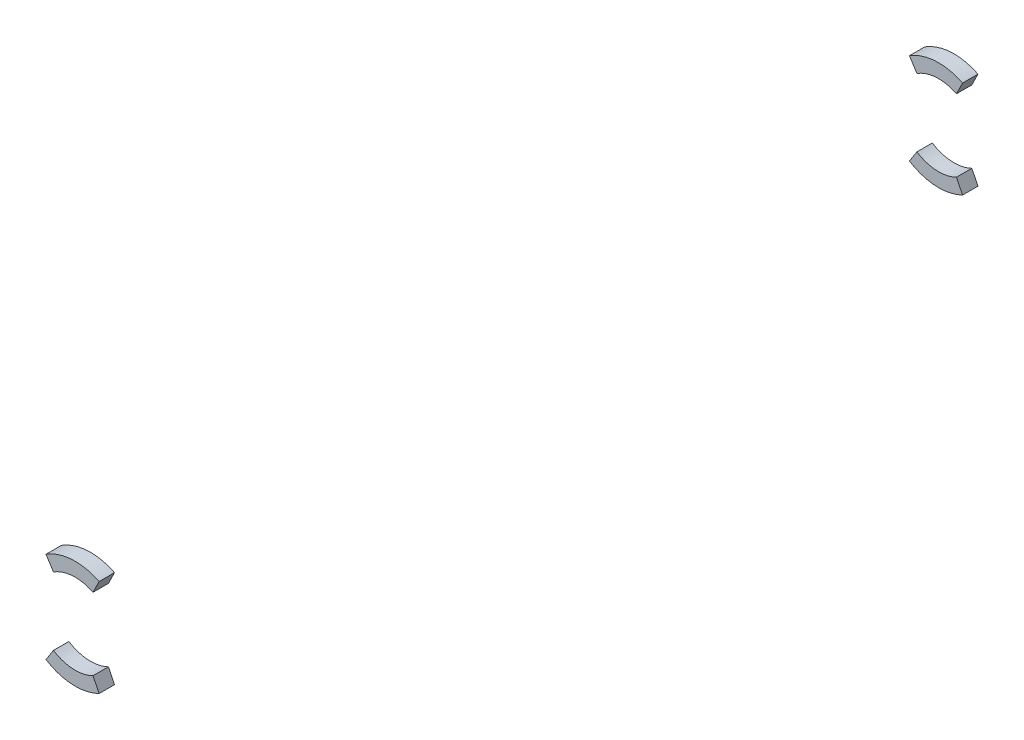
ISO-10303-21;
HEADER;
FILE_DESCRIPTION(('STEP AP214'),'2;1');
FILE_NAME('part.step','',(''),(''),'','','');
FILE_SCHEMA(('AUTOMOTIVE_DESIGN { 1 0 10303 214 1 1 1 1 }'));
ENDSEC;
DATA;
#1=APPLICATION_CONTEXT('core data for automotive mechanical design processes');
#2=APPLICATION_PROTOCOL_DEFINITION('international standard','automotive_design',2000,#1);
#3=PRODUCT_CONTEXT('',#1,'mechanical');
#4=PRODUCT('Part','Part','',(#3));
#5=PRODUCT_RELATED_PRODUCT_CATEGORY('part','',(#4));
#6=PRODUCT_DEFINITION_FORMATION('','',#4);
#7=PRODUCT_DEFINITION_CONTEXT('part definition',#1,'design');
#8=PRODUCT_DEFINITION('design','',#6,#7);
#9=PRODUCT_DEFINITION_SHAPE('','',#8);
#10=(LENGTH_UNIT() NAMED_UNIT(*) SI_UNIT(.MILLI.,.METRE.));
#11=(NAMED_UNIT(*) PLANE_ANGLE_UNIT() SI_UNIT($,.RADIAN.));
#12=(NAMED_UNIT(*) SI_UNIT($,.STERADIAN.) SOLID_ANGLE_UNIT());
#13=UNCERTAINTY_MEASURE_WITH_UNIT(LENGTH_MEASURE(1.E-05),#10,'distance_accuracy_value','');
#14=(GEOMETRIC_REPRESENTATION_CONTEXT(3) GLOBAL_UNCERTAINTY_ASSIGNED_CONTEXT((#13)) GLOBAL_UNIT_ASSIGNED_CONTEXT((#10,
#11,#12)) REPRESENTATION_CONTEXT('',''));
#15=CARTESIAN_POINT('',(0.,0.,0.));
#16=DIRECTION('',(0.,0.,1.));
#17=DIRECTION('',(1.,0.,0.));
#18=AXIS2_PLACEMENT_3D('',#15,#16,#17);
#19=CARTESIAN_POINT('',(0.,0.,1100.));
#20=DIRECTION('',(0.,0.,1.));
#21=DIRECTION('',(1.,0.,0.));
#22=AXIS2_PLACEMENT_3D('',#19,#20,#21);
#23=CYLINDRICAL_SURFACE('',#22,70.1988909444927);
#24=CARTESIAN_POINT('',(0.,0.,1120.));
#25=DIRECTION('',(0.,0.,1.));
#26=DIRECTION('',(1.,0.,0.));
#27=AXIS2_PLACEMENT_3D('',#24,#25,#26);
#28=CIRCLE('',#27,70.1988909444927);
#29=CARTESIAN_POINT('',(-37.8214558862849,-59.1390037494595,1120.));
#30=VERTEX_POINT('',#29);
#31=CARTESIAN_POINT('',(31.1075264082809,-62.9301683661731,1120.));
#32=VERTEX_POINT('',#31);
#33=EDGE_CURVE('E114',#30,#32,#28,.T.);
#34=ORIENTED_EDGE('',*,*,#33,.F.);
#35=DIRECTION('',(0.,0.,1.));
#36=VECTOR('',#35,1.);
#37=CARTESIAN_POINT('',(-37.8214558862849,-59.1390037494595,1100.));
#38=LINE('',#37,#36);
#39=CARTESIAN_POINT('',(-37.8214558862849,-59.1390037494595,1100.));
#40=VERTEX_POINT('',#39);
#41=EDGE_CURVE('E12',#40,#30,#38,.T.);
#42=ORIENTED_EDGE('',*,*,#41,.F.);
#43=CARTESIAN_POINT('',(0.,0.,1100.));
#44=DIRECTION('',(0.,0.,1.));
#45=DIRECTION('',(1.,0.,0.));
#46=AXIS2_PLACEMENT_3D('',#43,#44,#45);
#47=CIRCLE('',#46,70.1988909444927);
#48=CARTESIAN_POINT('',(31.1075264082809,-62.9301683661731,1100.));
#49=VERTEX_POINT('',#48);
#50=EDGE_CURVE('E108',#40,#49,#47,.T.);
#51=ORIENTED_EDGE('',*,*,#50,.T.);
#52=DIRECTION('',(0.,0.,1.));
#53=VECTOR('',#52,1.);
#54=CARTESIAN_POINT('',(31.1075264082809,-62.9301683661731,1100.));
#55=LINE('',#54,#53);
#56=EDGE_CURVE('E53',#49,#32,#55,.T.);
#57=ORIENTED_EDGE('',*,*,#56,.T.);
#58=EDGE_LOOP('',(#34,#42,#51,#57));
#59=FACE_BOUND('',#58,.T.);
#60=ADVANCED_FACE('F50',(#59),#23,.T.);
#61=CARTESIAN_POINT('',(-37.8214558862849,-59.1390037494595,1100.));
#62=DIRECTION('',(-0.842449260291328,0.538775689721237,0.));
#63=DIRECTION('',(-0.538775689721237,-0.842449260291328,0.));
#64=AXIS2_PLACEMENT_3D('',#61,#62,#63);
#65=PLANE('',#64);
#66=DIRECTION('',(-0.538775689721237,-0.842449260291328,0.));
#67=VECTOR('',#66,1.);
#68=CARTESIAN_POINT('',(-37.8214558862849,-59.1390037494595,1120.));
#69=LINE('',#68,#67);
#70=CARTESIAN_POINT('',(-28.1601263047385,-44.0321974946789,1120.));
#71=VERTEX_POINT('',#70);
#72=EDGE_CURVE('E110',#71,#30,#69,.T.);
#73=ORIENTED_EDGE('',*,*,#72,.F.);
#74=DIRECTION('',(0.,0.,1.));
#75=VECTOR('',#74,1.);
#76=CARTESIAN_POINT('',(-28.1601263047385,-44.0321974946789,1100.));
#77=LINE('',#76,#75);
#78=CARTESIAN_POINT('',(-28.1601263047385,-44.0321974946789,1100.));
#79=VERTEX_POINT('',#78);
#80=EDGE_CURVE('E59',#79,#71,#77,.T.);
#81=ORIENTED_EDGE('',*,*,#80,.F.);
#82=DIRECTION('',(-0.538775689721237,-0.842449260291328,0.));
#83=VECTOR('',#82,1.);
#84=CARTESIAN_POINT('',(-37.8214558862849,-59.1390037494595,1100.));
#85=LINE('',#84,#83);
#86=EDGE_CURVE('E105',#79,#40,#85,.T.);
#87=ORIENTED_EDGE('',*,*,#86,.T.);
#88=ORIENTED_EDGE('',*,*,#41,.T.);
#89=EDGE_LOOP('',(#73,#81,#87,#88));
#90=FACE_BOUND('',#89,.T.);
#91=ADVANCED_FACE('F124',(#90),#65,.T.);
#92=CARTESIAN_POINT('',(0.,0.,1100.));
#93=DIRECTION('',(0.,0.,1.));
#94=DIRECTION('',(1.,0.,0.));
#95=AXIS2_PLACEMENT_3D('',#92,#93,#94);
#96=CYLINDRICAL_SURFACE('',#95,52.2668836808665);
#97=CARTESIAN_POINT('',(0.,0.,1120.));
#98=DIRECTION('',(0.,0.,-1.));
#99=DIRECTION('',(1.,0.,0.));
#100=AXIS2_PLACEMENT_3D('',#97,#98,#99);
#101=CIRCLE('',#100,52.2668836808665);
#102=CARTESIAN_POINT('',(23.1612414741241,-46.8549252809834,1120.));
#103=VERTEX_POINT('',#102);
#104=EDGE_CURVE('E100',#103,#71,#101,.T.);
#105=ORIENTED_EDGE('',*,*,#104,.F.);
#106=DIRECTION('',(0.,0.,1.));
#107=VECTOR('',#106,1.);
#108=CARTESIAN_POINT('',(23.1612414741241,-46.8549252809834,1100.));
#109=LINE('',#108,#107);
#110=CARTESIAN_POINT('',(23.1612414741241,-46.8549252809834,1100.));
#111=VERTEX_POINT('',#110);
#112=EDGE_CURVE('E95',#111,#103,#109,.T.);
#113=ORIENTED_EDGE('',*,*,#112,.F.);
#114=CARTESIAN_POINT('',(0.,0.,1100.));
#115=DIRECTION('',(0.,0.,-1.));
#116=DIRECTION('',(1.,0.,0.));
#117=AXIS2_PLACEMENT_3D('',#114,#115,#116);
#118=CIRCLE('',#117,52.2668836808665);
#119=EDGE_CURVE('E98',#111,#79,#118,.T.);
#120=ORIENTED_EDGE('',*,*,#119,.T.);
#121=ORIENTED_EDGE('',*,*,#80,.T.);
#122=EDGE_LOOP('',(#105,#113,#120,#121));
#123=FACE_BOUND('',#122,.T.);
#124=ADVANCED_FACE('F97',(#123),#96,.F.);
#125=CARTESIAN_POINT('',(31.1075264082809,-62.9301683661731,1100.));
#126=DIRECTION('',(0.896455307476764,0.443134157673204,0.));
#127=DIRECTION('',(-0.443134157673204,0.896455307476764,0.));
#128=AXIS2_PLACEMENT_3D('',#125,#126,#127);
#129=PLANE('',#128);
#130=DIRECTION('',(-0.443134157673204,0.896455307476764,0.));
#131=VECTOR('',#130,1.);
#132=CARTESIAN_POINT('',(31.1075264082809,-62.9301683661731,1120.));
#133=LINE('',#132,#131);
#134=EDGE_CURVE('E117',#32,#103,#133,.T.);
#135=ORIENTED_EDGE('',*,*,#134,.F.);
#136=ORIENTED_EDGE('',*,*,#56,.F.);
#137=DIRECTION('',(-0.443134157673204,0.896455307476764,0.));
#138=VECTOR('',#137,1.);
#139=CARTESIAN_POINT('',(31.1075264082809,-62.9301683661731,1100.));
#140=LINE('',#139,#138);
#141=EDGE_CURVE('E104',#49,#111,#140,.T.);
#142=ORIENTED_EDGE('',*,*,#141,.T.);
#143=ORIENTED_EDGE('',*,*,#112,.T.);
#144=EDGE_LOOP('',(#135,#136,#142,#143));
#145=FACE_BOUND('',#144,.T.);
#146=ADVANCED_FACE('F107',(#145),#129,.T.);
#147=CARTESIAN_POINT('',(0.,0.,1100.));
#148=DIRECTION('',(0.,0.,1.));
#149=DIRECTION('',(1.,0.,0.));
#150=AXIS2_PLACEMENT_3D('',#147,#148,#149);
#151=PLANE('',#150);
#152=ORIENTED_EDGE('',*,*,#50,.F.);
#153=ORIENTED_EDGE('',*,*,#86,.F.);
#154=ORIENTED_EDGE('',*,*,#119,.F.);
#155=ORIENTED_EDGE('',*,*,#141,.F.);
#156=EDGE_LOOP('',(#152,#153,#154,#155));
#157=FACE_BOUND('',#156,.T.);
#158=ADVANCED_FACE('F103',(#157),#151,.F.);
#159=CARTESIAN_POINT('',(0.,0.,1120.));
#160=DIRECTION('',(0.,0.,1.));
#161=DIRECTION('',(1.,0.,0.));
#162=AXIS2_PLACEMENT_3D('',#159,#160,#161);
#163=PLANE('',#162);
#164=ORIENTED_EDGE('',*,*,#33,.T.);
#165=ORIENTED_EDGE('',*,*,#134,.T.);
#166=ORIENTED_EDGE('',*,*,#104,.T.);
#167=ORIENTED_EDGE('',*,*,#72,.T.);
#168=EDGE_LOOP('',(#164,#165,#166,#167));
#169=FACE_BOUND('',#168,.T.);
#170=ADVANCED_FACE('F123',(#169),#163,.T.);
#171=CLOSED_SHELL('',(#60,#91,#124,#146,#158,#170));
#172=MANIFOLD_SOLID_BREP('B2',#171);
#173=CARTESIAN_POINT('',(0.,0.,1100.));
#174=DIRECTION('',(0.,0.,1.));
#175=DIRECTION('',(1.,0.,0.));
#176=AXIS2_PLACEMENT_3D('',#173,#174,#175);
#177=CYLINDRICAL_SURFACE('',#176,70.1988909444927);
#178=CARTESIAN_POINT('',(0.,0.,1120.));
#179=DIRECTION('',(0.,0.,1.));
#180=DIRECTION('',(-1.,0.,0.));
#181=AXIS2_PLACEMENT_3D('',#178,#179,#180);
#182=CIRCLE('',#181,70.1988909444927);
#183=CARTESIAN_POINT('',(31.1075264082809,62.9301683661731,1120.));
#184=VERTEX_POINT('',#183);
#185=CARTESIAN_POINT('',(-37.8214558862849,59.1390037494595,1120.));
#186=VERTEX_POINT('',#185);
#187=EDGE_CURVE('E254',#184,#186,#182,.T.);
#188=ORIENTED_EDGE('',*,*,#187,.F.);
#189=DIRECTION('',(0.,0.,1.));
#190=VECTOR('',#189,1.);
#191=CARTESIAN_POINT('',(31.1075264082809,62.9301683661731,1100.));
#192=LINE('',#191,#190);
#193=CARTESIAN_POINT('',(31.1075264082809,62.9301683661731,1100.));
#194=VERTEX_POINT('',#193);
#195=EDGE_CURVE('E48',#194,#184,#192,.T.);
#196=ORIENTED_EDGE('',*,*,#195,.F.);
#197=CARTESIAN_POINT('',(0.,0.,1100.));
#198=DIRECTION('',(0.,0.,1.));
#199=DIRECTION('',(-1.,0.,0.));
#200=AXIS2_PLACEMENT_3D('',#197,#198,#199);
#201=CIRCLE('',#200,70.1988909444927);
#202=CARTESIAN_POINT('',(-37.8214558862849,59.1390037494595,1100.));
#203=VERTEX_POINT('',#202);
#204=EDGE_CURVE('E246',#194,#203,#201,.T.);
#205=ORIENTED_EDGE('',*,*,#204,.T.);
#206=DIRECTION('',(0.,0.,1.));
#207=VECTOR('',#206,1.);
#208=CARTESIAN_POINT('',(-37.8214558862849,59.1390037494595,1100.));
#209=LINE('',#208,#207);
#210=EDGE_CURVE('E187',#203,#186,#209,.T.);
#211=ORIENTED_EDGE('',*,*,#210,.T.);
#212=EDGE_LOOP('',(#188,#196,#205,#211));
#213=FACE_BOUND('',#212,.T.);
#214=ADVANCED_FACE('F184',(#213),#177,.T.);
#215=CARTESIAN_POINT('',(31.1075264082809,62.9301683661731,1100.));
#216=DIRECTION('',(0.896455307476764,-0.443134157673204,0.));
#217=DIRECTION('',(0.443134157673204,0.896455307476764,0.));
#218=AXIS2_PLACEMENT_3D('',#215,#216,#217);
#219=PLANE('',#218);
#220=DIRECTION('',(0.443134157673204,0.896455307476764,0.));
#221=VECTOR('',#220,1.);
#222=CARTESIAN_POINT('',(31.1075264082809,62.9301683661731,1120.));
#223=LINE('',#222,#221);
#224=CARTESIAN_POINT('',(23.1612414741241,46.8549252809834,1120.));
#225=VERTEX_POINT('',#224);
#226=EDGE_CURVE('E249',#225,#184,#223,.T.);
#227=ORIENTED_EDGE('',*,*,#226,.F.);
#228=DIRECTION('',(0.,0.,1.));
#229=VECTOR('',#228,1.);
#230=CARTESIAN_POINT('',(23.1612414741241,46.8549252809834,1100.));
#231=LINE('',#230,#229);
#232=CARTESIAN_POINT('',(23.1612414741241,46.8549252809834,1100.));
#233=VERTEX_POINT('',#232);
#234=EDGE_CURVE('E194',#233,#225,#231,.T.);
#235=ORIENTED_EDGE('',*,*,#234,.F.);
#236=DIRECTION('',(0.443134157673204,0.896455307476764,0.));
#237=VECTOR('',#236,1.);
#238=CARTESIAN_POINT('',(31.1075264082809,62.9301683661731,1100.));
#239=LINE('',#238,#237);
#240=EDGE_CURVE('E241',#233,#194,#239,.T.);
#241=ORIENTED_EDGE('',*,*,#240,.T.);
#242=ORIENTED_EDGE('',*,*,#195,.T.);
#243=EDGE_LOOP('',(#227,#235,#241,#242));
#244=FACE_BOUND('',#243,.T.);
#245=ADVANCED_FACE('F270',(#244),#219,.T.);
#246=CARTESIAN_POINT('',(0.,0.,1100.));
#247=DIRECTION('',(0.,0.,1.));
#248=DIRECTION('',(1.,0.,0.));
#249=AXIS2_PLACEMENT_3D('',#246,#247,#248);
#250=CYLINDRICAL_SURFACE('',#249,52.2668836808665);
#251=CARTESIAN_POINT('',(0.,0.,1120.));
#252=DIRECTION('',(0.,0.,-1.));
#253=DIRECTION('',(-1.,0.,0.));
#254=AXIS2_PLACEMENT_3D('',#251,#252,#253);
#255=CIRCLE('',#254,52.2668836808665);
#256=CARTESIAN_POINT('',(-28.1601263047385,44.0321974946789,1120.));
#257=VERTEX_POINT('',#256);
#258=EDGE_CURVE('E235',#257,#225,#255,.T.);
#259=ORIENTED_EDGE('',*,*,#258,.F.);
#260=DIRECTION('',(0.,0.,1.));
#261=VECTOR('',#260,1.);
#262=CARTESIAN_POINT('',(-28.1601263047385,44.0321974946789,1100.));
#263=LINE('',#262,#261);
#264=CARTESIAN_POINT('',(-28.1601263047385,44.0321974946789,1100.));
#265=VERTEX_POINT('',#264);
#266=EDGE_CURVE('E230',#265,#257,#263,.T.);
#267=ORIENTED_EDGE('',*,*,#266,.F.);
#268=CARTESIAN_POINT('',(0.,0.,1100.));
#269=DIRECTION('',(0.,0.,-1.));
#270=DIRECTION('',(-1.,0.,0.));
#271=AXIS2_PLACEMENT_3D('',#268,#269,#270);
#272=CIRCLE('',#271,52.2668836808665);
#273=EDGE_CURVE('E233',#265,#233,#272,.T.);
#274=ORIENTED_EDGE('',*,*,#273,.T.);
#275=ORIENTED_EDGE('',*,*,#234,.T.);
#276=EDGE_LOOP('',(#259,#267,#274,#275));
#277=FACE_BOUND('',#276,.T.);
#278=ADVANCED_FACE('F232',(#277),#250,.F.);
#279=CARTESIAN_POINT('',(-37.8214558862849,59.1390037494595,1100.));
#280=DIRECTION('',(-0.842449260291328,-0.538775689721237,0.));
#281=DIRECTION('',(0.538775689721237,-0.842449260291328,0.));
#282=AXIS2_PLACEMENT_3D('',#279,#280,#281);
#283=PLANE('',#282);
#284=DIRECTION('',(0.538775689721237,-0.842449260291328,0.));
#285=VECTOR('',#284,1.);
#286=CARTESIAN_POINT('',(-37.8214558862849,59.1390037494595,1120.));
#287=LINE('',#286,#285);
#288=EDGE_CURVE('E258',#186,#257,#287,.T.);
#289=ORIENTED_EDGE('',*,*,#288,.F.);
#290=ORIENTED_EDGE('',*,*,#210,.F.);
#291=DIRECTION('',(0.538775689721237,-0.842449260291328,0.));
#292=VECTOR('',#291,1.);
#293=CARTESIAN_POINT('',(-37.8214558862849,59.1390037494595,1100.));
#294=LINE('',#293,#292);
#295=EDGE_CURVE('E240',#203,#265,#294,.T.);
#296=ORIENTED_EDGE('',*,*,#295,.T.);
#297=ORIENTED_EDGE('',*,*,#266,.T.);
#298=EDGE_LOOP('',(#289,#290,#296,#297));
#299=FACE_BOUND('',#298,.T.);
#300=ADVANCED_FACE('F244',(#299),#283,.T.);
#301=CARTESIAN_POINT('',(0.,0.,1100.));
#302=DIRECTION('',(0.,0.,-1.));
#303=DIRECTION('',(-1.,0.,0.));
#304=AXIS2_PLACEMENT_3D('',#301,#302,#303);
#305=PLANE('',#304);
#306=ORIENTED_EDGE('',*,*,#204,.F.);
#307=ORIENTED_EDGE('',*,*,#240,.F.);
#308=ORIENTED_EDGE('',*,*,#273,.F.);
#309=ORIENTED_EDGE('',*,*,#295,.F.);
#310=EDGE_LOOP('',(#306,#307,#308,#309));
#311=FACE_BOUND('',#310,.T.);
#312=ADVANCED_FACE('F239',(#311),#305,.T.);
#313=CARTESIAN_POINT('',(0.,0.,1120.));
#314=DIRECTION('',(0.,0.,-1.));
#315=DIRECTION('',(-1.,0.,0.));
#316=AXIS2_PLACEMENT_3D('',#313,#314,#315);
#317=PLANE('',#316);
#318=ORIENTED_EDGE('',*,*,#187,.T.);
#319=ORIENTED_EDGE('',*,*,#288,.T.);
#320=ORIENTED_EDGE('',*,*,#258,.T.);
#321=ORIENTED_EDGE('',*,*,#226,.T.);
#322=EDGE_LOOP('',(#318,#319,#320,#321));
#323=FACE_BOUND('',#322,.T.);
#324=ADVANCED_FACE('F269',(#323),#317,.F.);
#325=CLOSED_SHELL('',(#214,#245,#278,#300,#312,#324));
#326=MANIFOLD_SOLID_BREP('B6',#325);
#327=CARTESIAN_POINT('',(0.,0.,-20.));
#328=DIRECTION('',(0.,0.,1.));
#329=DIRECTION('',(1.,0.,0.));
#330=AXIS2_PLACEMENT_3D('',#327,#328,#329);
#331=CYLINDRICAL_SURFACE('',#330,70.1988909444927);
#332=CARTESIAN_POINT('',(0.,0.,0.));
#333=DIRECTION('',(0.,0.,1.));
#334=DIRECTION('',(1.,0.,0.));
#335=AXIS2_PLACEMENT_3D('',#332,#333,#334);
#336=CIRCLE('',#335,70.1988909444927);
#337=CARTESIAN_POINT('',(-37.8214558862849,-59.1390037494595,0.));
#338=VERTEX_POINT('',#337);
#339=CARTESIAN_POINT('',(31.1075264082809,-62.9301683661731,0.));
#340=VERTEX_POINT('',#339);
#341=EDGE_CURVE('E393',#338,#340,#336,.T.);
#342=ORIENTED_EDGE('',*,*,#341,.F.);
#343=DIRECTION('',(0.,0.,1.));
#344=VECTOR('',#343,1.);
#345=CARTESIAN_POINT('',(-37.8214558862849,-59.1390037494595,-20.));
#346=LINE('',#345,#344);
#347=CARTESIAN_POINT('',(-37.8214558862849,-59.1390037494595,-20.));
#348=VERTEX_POINT('',#347);
#349=EDGE_CURVE('E182',#348,#338,#346,.T.);
#350=ORIENTED_EDGE('',*,*,#349,.F.);
#351=CARTESIAN_POINT('',(0.,0.,-20.));
#352=DIRECTION('',(0.,0.,1.));
#353=DIRECTION('',(1.,0.,0.));
#354=AXIS2_PLACEMENT_3D('',#351,#352,#353);
#355=CIRCLE('',#354,70.1988909444927);
#356=CARTESIAN_POINT('',(31.1075264082809,-62.9301683661731,-20.));
#357=VERTEX_POINT('',#356);
#358=EDGE_CURVE('E387',#348,#357,#355,.T.);
#359=ORIENTED_EDGE('',*,*,#358,.T.);
#360=DIRECTION('',(0.,0.,1.));
#361=VECTOR('',#360,1.);
#362=CARTESIAN_POINT('',(31.1075264082809,-62.9301683661731,-20.));
#363=LINE('',#362,#361);
#364=EDGE_CURVE('E332',#357,#340,#363,.T.);
#365=ORIENTED_EDGE('',*,*,#364,.T.);
#366=EDGE_LOOP('',(#342,#350,#359,#365));
#367=FACE_BOUND('',#366,.T.);
#368=ADVANCED_FACE('F329',(#367),#331,.T.);
#369=CARTESIAN_POINT('',(-37.8214558862849,-59.1390037494595,-20.));
#370=DIRECTION('',(-0.842449260291328,0.538775689721237,0.));
#371=DIRECTION('',(-0.538775689721237,-0.842449260291328,0.));
#372=AXIS2_PLACEMENT_3D('',#369,#370,#371);
#373=PLANE('',#372);
#374=DIRECTION('',(-0.538775689721237,-0.842449260291328,0.));
#375=VECTOR('',#374,1.);
#376=CARTESIAN_POINT('',(-37.8214558862849,-59.1390037494595,0.));
#377=LINE('',#376,#375);
#378=CARTESIAN_POINT('',(-28.1601263047385,-44.0321974946789,0.));
#379=VERTEX_POINT('',#378);
#380=EDGE_CURVE('E389',#379,#338,#377,.T.);
#381=ORIENTED_EDGE('',*,*,#380,.F.);
#382=DIRECTION('',(0.,0.,1.));
#383=VECTOR('',#382,1.);
#384=CARTESIAN_POINT('',(-28.1601263047385,-44.0321974946789,-20.));
#385=LINE('',#384,#383);
#386=CARTESIAN_POINT('',(-28.1601263047385,-44.0321974946789,-20.));
#387=VERTEX_POINT('',#386);
#388=EDGE_CURVE('E338',#387,#379,#385,.T.);
#389=ORIENTED_EDGE('',*,*,#388,.F.);
#390=DIRECTION('',(-0.538775689721237,-0.842449260291328,0.));
#391=VECTOR('',#390,1.);
#392=CARTESIAN_POINT('',(-37.8214558862849,-59.1390037494595,-20.));
#393=LINE('',#392,#391);
#394=EDGE_CURVE('E384',#387,#348,#393,.T.);
#395=ORIENTED_EDGE('',*,*,#394,.T.);
#396=ORIENTED_EDGE('',*,*,#349,.T.);
#397=EDGE_LOOP('',(#381,#389,#395,#396));
#398=FACE_BOUND('',#397,.T.);
#399=ADVANCED_FACE('F403',(#398),#373,.T.);
#400=CARTESIAN_POINT('',(0.,0.,-20.));
#401=DIRECTION('',(0.,0.,1.));
#402=DIRECTION('',(1.,0.,0.));
#403=AXIS2_PLACEMENT_3D('',#400,#401,#402);
#404=CYLINDRICAL_SURFACE('',#403,52.2668836808665);
#405=CARTESIAN_POINT('',(0.,0.,0.));
#406=DIRECTION('',(0.,0.,-1.));
#407=DIRECTION('',(1.,0.,0.));
#408=AXIS2_PLACEMENT_3D('',#405,#406,#407);
#409=CIRCLE('',#408,52.2668836808665);
#410=CARTESIAN_POINT('',(23.1612414741241,-46.8549252809834,0.));
#411=VERTEX_POINT('',#410);
#412=EDGE_CURVE('E379',#411,#379,#409,.T.);
#413=ORIENTED_EDGE('',*,*,#412,.F.);
#414=DIRECTION('',(0.,0.,1.));
#415=VECTOR('',#414,1.);
#416=CARTESIAN_POINT('',(23.1612414741241,-46.8549252809834,-20.));
#417=LINE('',#416,#415);
#418=CARTESIAN_POINT('',(23.1612414741241,-46.8549252809834,-20.));
#419=VERTEX_POINT('',#418);
#420=EDGE_CURVE('E374',#419,#411,#417,.T.);
#421=ORIENTED_EDGE('',*,*,#420,.F.);
#422=CARTESIAN_POINT('',(0.,0.,-20.));
#423=DIRECTION('',(0.,0.,-1.));
#424=DIRECTION('',(1.,0.,0.));
#425=AXIS2_PLACEMENT_3D('',#422,#423,#424);
#426=CIRCLE('',#425,52.2668836808665);
#427=EDGE_CURVE('E377',#419,#387,#426,.T.);
#428=ORIENTED_EDGE('',*,*,#427,.T.);
#429=ORIENTED_EDGE('',*,*,#388,.T.);
#430=EDGE_LOOP('',(#413,#421,#428,#429));
#431=FACE_BOUND('',#430,.T.);
#432=ADVANCED_FACE('F376',(#431),#404,.F.);
#433=CARTESIAN_POINT('',(31.1075264082809,-62.9301683661731,-20.));
#434=DIRECTION('',(0.896455307476764,0.443134157673204,0.));
#435=DIRECTION('',(-0.443134157673204,0.896455307476764,0.));
#436=AXIS2_PLACEMENT_3D('',#433,#434,#435);
#437=PLANE('',#436);
#438=DIRECTION('',(-0.443134157673204,0.896455307476764,0.));
#439=VECTOR('',#438,1.);
#440=CARTESIAN_POINT('',(31.1075264082809,-62.9301683661731,0.));
#441=LINE('',#440,#439);
#442=EDGE_CURVE('E396',#340,#411,#441,.T.);
#443=ORIENTED_EDGE('',*,*,#442,.F.);
#444=ORIENTED_EDGE('',*,*,#364,.F.);
#445=DIRECTION('',(-0.443134157673204,0.896455307476764,0.));
#446=VECTOR('',#445,1.);
#447=CARTESIAN_POINT('',(31.1075264082809,-62.9301683661731,-20.));
#448=LINE('',#447,#446);
#449=EDGE_CURVE('E383',#357,#419,#448,.T.);
#450=ORIENTED_EDGE('',*,*,#449,.T.);
#451=ORIENTED_EDGE('',*,*,#420,.T.);
#452=EDGE_LOOP('',(#443,#444,#450,#451));
#453=FACE_BOUND('',#452,.T.);
#454=ADVANCED_FACE('F386',(#453),#437,.T.);
#455=CARTESIAN_POINT('',(0.,0.,-20.));
#456=DIRECTION('',(0.,0.,1.));
#457=DIRECTION('',(1.,0.,0.));
#458=AXIS2_PLACEMENT_3D('',#455,#456,#457);
#459=PLANE('',#458);
#460=ORIENTED_EDGE('',*,*,#358,.F.);
#461=ORIENTED_EDGE('',*,*,#394,.F.);
#462=ORIENTED_EDGE('',*,*,#427,.F.);
#463=ORIENTED_EDGE('',*,*,#449,.F.);
#464=EDGE_LOOP('',(#460,#461,#462,#463));
#465=FACE_BOUND('',#464,.T.);
#466=ADVANCED_FACE('F382',(#465),#459,.F.);
#467=CARTESIAN_POINT('',(0.,0.,0.));
#468=DIRECTION('',(0.,0.,1.));
#469=DIRECTION('',(1.,0.,0.));
#470=AXIS2_PLACEMENT_3D('',#467,#468,#469);
#471=PLANE('',#470);
#472=ORIENTED_EDGE('',*,*,#341,.T.);
#473=ORIENTED_EDGE('',*,*,#442,.T.);
#474=ORIENTED_EDGE('',*,*,#412,.T.);
#475=ORIENTED_EDGE('',*,*,#380,.T.);
#476=EDGE_LOOP('',(#472,#473,#474,#475));
#477=FACE_BOUND('',#476,.T.);
#478=ADVANCED_FACE('F402',(#477),#471,.T.);
#479=CLOSED_SHELL('',(#368,#399,#432,#454,#466,#478));
#480=MANIFOLD_SOLID_BREP('B42',#479);
#481=CARTESIAN_POINT('',(0.,0.,-20.));
#482=DIRECTION('',(0.,0.,1.));
#483=DIRECTION('',(1.,0.,0.));
#484=AXIS2_PLACEMENT_3D('',#481,#482,#483);
#485=CYLINDRICAL_SURFACE('',#484,70.1988909444927);
#486=CARTESIAN_POINT('',(0.,0.,0.));
#487=DIRECTION('',(0.,0.,1.));
#488=DIRECTION('',(-1.,0.,0.));
#489=AXIS2_PLACEMENT_3D('',#486,#487,#488);
#490=CIRCLE('',#489,70.1988909444927);
#491=CARTESIAN_POINT('',(31.1075264082809,62.9301683661731,0.));
#492=VERTEX_POINT('',#491);
#493=CARTESIAN_POINT('',(-37.8214558862849,59.1390037494595,0.));
#494=VERTEX_POINT('',#493);
#495=EDGE_CURVE('E517',#492,#494,#490,.T.);
#496=ORIENTED_EDGE('',*,*,#495,.F.);
#497=DIRECTION('',(0.,0.,1.));
#498=VECTOR('',#497,1.);
#499=CARTESIAN_POINT('',(31.1075264082809,62.9301683661731,-20.));
#500=LINE('',#499,#498);
#501=CARTESIAN_POINT('',(31.1075264082809,62.9301683661731,-20.));
#502=VERTEX_POINT('',#501);
#503=EDGE_CURVE('E327',#502,#492,#500,.T.);
#504=ORIENTED_EDGE('',*,*,#503,.F.);
#505=CARTESIAN_POINT('',(0.,0.,-20.));
#506=DIRECTION('',(0.,0.,1.));
#507=DIRECTION('',(-1.,0.,0.));
#508=AXIS2_PLACEMENT_3D('',#505,#506,#507);
#509=CIRCLE('',#508,70.1988909444927);
#510=CARTESIAN_POINT('',(-37.8214558862849,59.1390037494595,-20.));
#511=VERTEX_POINT('',#510);
#512=EDGE_CURVE('E511',#502,#511,#509,.T.);
#513=ORIENTED_EDGE('',*,*,#512,.T.);
#514=DIRECTION('',(0.,0.,1.));
#515=VECTOR('',#514,1.);
#516=CARTESIAN_POINT('',(-37.8214558862849,59.1390037494595,-20.));
#517=LINE('',#516,#515);
#518=EDGE_CURVE('E456',#511,#494,#517,.T.);
#519=ORIENTED_EDGE('',*,*,#518,.T.);
#520=EDGE_LOOP('',(#496,#504,#513,#519));
#521=FACE_BOUND('',#520,.T.);
#522=ADVANCED_FACE('F453',(#521),#485,.T.);
#523=CARTESIAN_POINT('',(31.1075264082809,62.9301683661731,-20.));
#524=DIRECTION('',(0.896455307476764,-0.443134157673204,0.));
#525=DIRECTION('',(0.443134157673204,0.896455307476764,0.));
#526=AXIS2_PLACEMENT_3D('',#523,#524,#525);
#527=PLANE('',#526);
#528=DIRECTION('',(0.443134157673204,0.896455307476764,0.));
#529=VECTOR('',#528,1.);
#530=CARTESIAN_POINT('',(31.1075264082809,62.9301683661731,0.));
#531=LINE('',#530,#529);
#532=CARTESIAN_POINT('',(23.1612414741241,46.8549252809834,0.));
#533=VERTEX_POINT('',#532);
#534=EDGE_CURVE('E513',#533,#492,#531,.T.);
#535=ORIENTED_EDGE('',*,*,#534,.F.);
#536=DIRECTION('',(0.,0.,1.));
#537=VECTOR('',#536,1.);
#538=CARTESIAN_POINT('',(23.1612414741241,46.8549252809834,-20.));
#539=LINE('',#538,#537);
#540=CARTESIAN_POINT('',(23.1612414741241,46.8549252809834,-20.));
#541=VERTEX_POINT('',#540);
#542=EDGE_CURVE('E462',#541,#533,#539,.T.);
#543=ORIENTED_EDGE('',*,*,#542,.F.);
#544=DIRECTION('',(0.443134157673204,0.896455307476764,0.));
#545=VECTOR('',#544,1.);
#546=CARTESIAN_POINT('',(31.1075264082809,62.9301683661731,-20.));
#547=LINE('',#546,#545);
#548=EDGE_CURVE('E508',#541,#502,#547,.T.);
#549=ORIENTED_EDGE('',*,*,#548,.T.);
#550=ORIENTED_EDGE('',*,*,#503,.T.);
#551=EDGE_LOOP('',(#535,#543,#549,#550));
#552=FACE_BOUND('',#551,.T.);
#553=ADVANCED_FACE('F527',(#552),#527,.T.);
#554=CARTESIAN_POINT('',(0.,0.,-20.));
#555=DIRECTION('',(0.,0.,1.));
#556=DIRECTION('',(1.,0.,0.));
#557=AXIS2_PLACEMENT_3D('',#554,#555,#556);
#558=CYLINDRICAL_SURFACE('',#557,52.2668836808665);
#559=CARTESIAN_POINT('',(0.,0.,0.));
#560=DIRECTION('',(0.,0.,-1.));
#561=DIRECTION('',(-1.,0.,0.));
#562=AXIS2_PLACEMENT_3D('',#559,#560,#561);
#563=CIRCLE('',#562,52.2668836808665);
#564=CARTESIAN_POINT('',(-28.1601263047385,44.0321974946789,0.));
#565=VERTEX_POINT('',#564);
#566=EDGE_CURVE('E503',#565,#533,#563,.T.);
#567=ORIENTED_EDGE('',*,*,#566,.F.);
#568=DIRECTION('',(0.,0.,1.));
#569=VECTOR('',#568,1.);
#570=CARTESIAN_POINT('',(-28.1601263047385,44.0321974946789,-20.));
#571=LINE('',#570,#569);
#572=CARTESIAN_POINT('',(-28.1601263047385,44.0321974946789,-20.));
#573=VERTEX_POINT('',#572);
#574=EDGE_CURVE('E498',#573,#565,#571,.T.);
#575=ORIENTED_EDGE('',*,*,#574,.F.);
#576=CARTESIAN_POINT('',(0.,0.,-20.));
#577=DIRECTION('',(0.,0.,-1.));
#578=DIRECTION('',(-1.,0.,0.));
#579=AXIS2_PLACEMENT_3D('',#576,#577,#578);
#580=CIRCLE('',#579,52.2668836808665);
#581=EDGE_CURVE('E501',#573,#541,#580,.T.);
#582=ORIENTED_EDGE('',*,*,#581,.T.);
#583=ORIENTED_EDGE('',*,*,#542,.T.);
#584=EDGE_LOOP('',(#567,#575,#582,#583));
#585=FACE_BOUND('',#584,.T.);
#586=ADVANCED_FACE('F500',(#585),#558,.F.);
#587=CARTESIAN_POINT('',(-37.8214558862849,59.1390037494595,-20.));
#588=DIRECTION('',(-0.842449260291328,-0.538775689721237,0.));
#589=DIRECTION('',(0.538775689721237,-0.842449260291328,0.));
#590=AXIS2_PLACEMENT_3D('',#587,#588,#589);
#591=PLANE('',#590);
#592=DIRECTION('',(0.538775689721237,-0.842449260291328,0.));
#593=VECTOR('',#592,1.);
#594=CARTESIAN_POINT('',(-37.8214558862849,59.1390037494595,0.));
#595=LINE('',#594,#593);
#596=EDGE_CURVE('E520',#494,#565,#595,.T.);
#597=ORIENTED_EDGE('',*,*,#596,.F.);
#598=ORIENTED_EDGE('',*,*,#518,.F.);
#599=DIRECTION('',(0.538775689721237,-0.842449260291328,0.));
#600=VECTOR('',#599,1.);
#601=CARTESIAN_POINT('',(-37.8214558862849,59.1390037494595,-20.));
#602=LINE('',#601,#600);
#603=EDGE_CURVE('E507',#511,#573,#602,.T.);
#604=ORIENTED_EDGE('',*,*,#603,.T.);
#605=ORIENTED_EDGE('',*,*,#574,.T.);
#606=EDGE_LOOP('',(#597,#598,#604,#605));
#607=FACE_BOUND('',#606,.T.);
#608=ADVANCED_FACE('F510',(#607),#591,.T.);
#609=CARTESIAN_POINT('',(0.,0.,-20.));
#610=DIRECTION('',(0.,0.,-1.));
#611=DIRECTION('',(-1.,0.,0.));
#612=AXIS2_PLACEMENT_3D('',#609,#610,#611);
#613=PLANE('',#612);
#614=ORIENTED_EDGE('',*,*,#512,.F.);
#615=ORIENTED_EDGE('',*,*,#548,.F.);
#616=ORIENTED_EDGE('',*,*,#581,.F.);
#617=ORIENTED_EDGE('',*,*,#603,.F.);
#618=EDGE_LOOP('',(#614,#615,#616,#617));
#619=FACE_BOUND('',#618,.T.);
#620=ADVANCED_FACE('F506',(#619),#613,.T.);
#621=CARTESIAN_POINT('',(0.,0.,0.));
#622=DIRECTION('',(0.,0.,-1.));
#623=DIRECTION('',(-1.,0.,0.));
#624=AXIS2_PLACEMENT_3D('',#621,#622,#623);
#625=PLANE('',#624);
#626=ORIENTED_EDGE('',*,*,#495,.T.);
#627=ORIENTED_EDGE('',*,*,#596,.T.);
#628=ORIENTED_EDGE('',*,*,#566,.T.);
#629=ORIENTED_EDGE('',*,*,#534,.T.);
#630=EDGE_LOOP('',(#626,#627,#628,#629));
#631=FACE_BOUND('',#630,.T.);
#632=ADVANCED_FACE('F526',(#631),#625,.F.);
#633=CLOSED_SHELL('',(#522,#553,#586,#608,#620,#632));
#634=MANIFOLD_SOLID_BREP('B176',#633);
#635=ADVANCED_BREP_SHAPE_REPRESENTATION('',(#18,#172,#326,#480,#634),#14);
#636=SHAPE_DEFINITION_REPRESENTATION(#9,#635);
ENDSEC;
END-ISO-10303-21;
